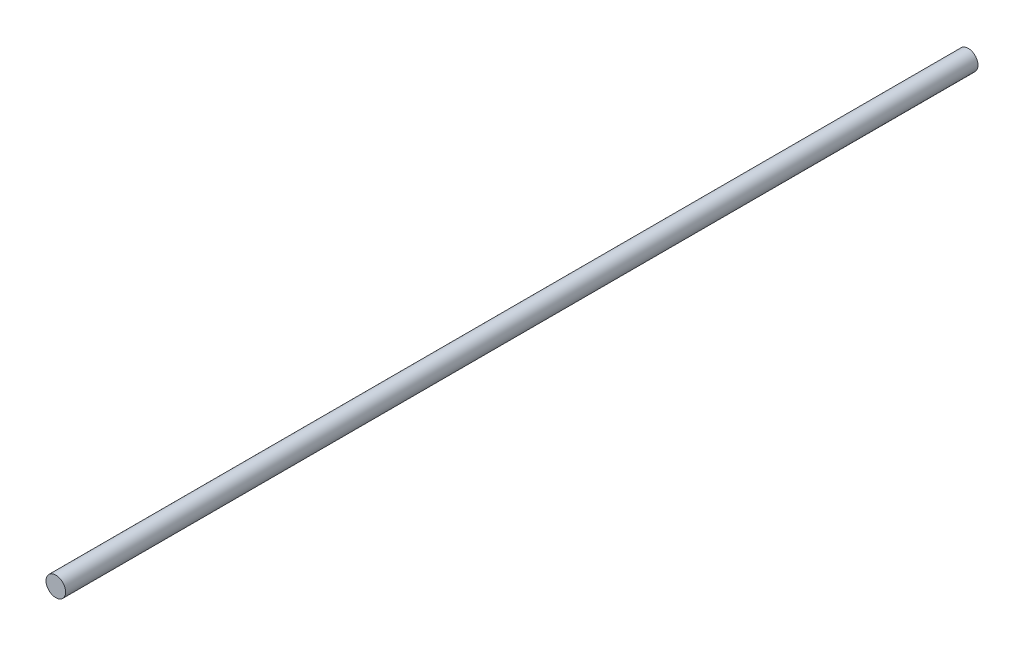
ISO-10303-21;
HEADER;
FILE_DESCRIPTION(('STEP AP214'),'2;1');
FILE_NAME('part.step','',(''),(''),'','','');
FILE_SCHEMA(('AUTOMOTIVE_DESIGN { 1 0 10303 214 1 1 1 1 }'));
ENDSEC;
DATA;
#1=APPLICATION_CONTEXT('core data for automotive mechanical design processes');
#2=APPLICATION_PROTOCOL_DEFINITION('international standard','automotive_design',2000,#1);
#3=PRODUCT_CONTEXT('',#1,'mechanical');
#4=PRODUCT('Part','Part','',(#3));
#5=PRODUCT_RELATED_PRODUCT_CATEGORY('part','',(#4));
#6=PRODUCT_DEFINITION_FORMATION('','',#4);
#7=PRODUCT_DEFINITION_CONTEXT('part definition',#1,'design');
#8=PRODUCT_DEFINITION('design','',#6,#7);
#9=PRODUCT_DEFINITION_SHAPE('','',#8);
#10=(LENGTH_UNIT() NAMED_UNIT(*) SI_UNIT(.MILLI.,.METRE.));
#11=(NAMED_UNIT(*) PLANE_ANGLE_UNIT() SI_UNIT($,.RADIAN.));
#12=(NAMED_UNIT(*) SI_UNIT($,.STERADIAN.) SOLID_ANGLE_UNIT());
#13=UNCERTAINTY_MEASURE_WITH_UNIT(LENGTH_MEASURE(1.E-05),#10,'distance_accuracy_value','');
#14=(GEOMETRIC_REPRESENTATION_CONTEXT(3) GLOBAL_UNCERTAINTY_ASSIGNED_CONTEXT((#13)) GLOBAL_UNIT_ASSIGNED_CONTEXT((#10,
#11,#12)) REPRESENTATION_CONTEXT('',''));
#15=CARTESIAN_POINT('',(0.,0.,0.));
#16=DIRECTION('',(0.,0.,1.));
#17=DIRECTION('',(1.,0.,0.));
#18=AXIS2_PLACEMENT_3D('',#15,#16,#17);
#19=CARTESIAN_POINT('',(0.,0.,372.));
#20=DIRECTION('',(0.,0.,-1.));
#21=DIRECTION('',(-1.,0.,0.));
#22=AXIS2_PLACEMENT_3D('',#19,#20,#21);
#23=CYLINDRICAL_SURFACE('',#22,4.);
#24=CARTESIAN_POINT('',(0.,0.,372.));
#25=DIRECTION('',(0.,0.,1.));
#26=DIRECTION('',(1.,0.,0.));
#27=AXIS2_PLACEMENT_3D('',#24,#25,#26);
#28=CIRCLE('',#27,4.);
#29=CARTESIAN_POINT('',(-4.,0.,372.));
#30=VERTEX_POINT('',#29);
#31=EDGE_CURVE('E10',#30,#30,#28,.T.);
#32=CARTESIAN_POINT('',(0.,0.,0.));
#33=DIRECTION('',(0.,0.,1.));
#34=DIRECTION('',(1.,0.,0.));
#35=AXIS2_PLACEMENT_3D('',#32,#33,#34);
#36=CIRCLE('',#35,4.);
#37=CARTESIAN_POINT('',(-4.,0.,0.));
#38=VERTEX_POINT('',#37);
#39=EDGE_CURVE('E33',#38,#38,#36,.T.);
#40=CARTESIAN_POINT('',(-4.,0.,372.));
#41=CARTESIAN_POINT('',(-4.,0.,368.125));
#42=CARTESIAN_POINT('',(-4.,0.,364.25));
#43=CARTESIAN_POINT('',(-4.,0.,356.5));
#44=CARTESIAN_POINT('',(-4.,0.,352.625));
#45=CARTESIAN_POINT('',(-4.,0.,344.875));
#46=CARTESIAN_POINT('',(-4.,0.,341.));
#47=CARTESIAN_POINT('',(-4.,0.,333.25));
#48=CARTESIAN_POINT('',(-4.,0.,329.375));
#49=CARTESIAN_POINT('',(-4.,0.,321.625));
#50=CARTESIAN_POINT('',(-4.,0.,317.75));
#51=CARTESIAN_POINT('',(-4.,0.,310.));
#52=CARTESIAN_POINT('',(-4.,0.,306.125));
#53=CARTESIAN_POINT('',(-4.,0.,298.375));
#54=CARTESIAN_POINT('',(-4.,0.,294.5));
#55=CARTESIAN_POINT('',(-4.,0.,286.75));
#56=CARTESIAN_POINT('',(-4.,0.,282.875));
#57=CARTESIAN_POINT('',(-4.,0.,275.125));
#58=CARTESIAN_POINT('',(-4.,0.,271.25));
#59=CARTESIAN_POINT('',(-4.,0.,263.5));
#60=CARTESIAN_POINT('',(-4.,0.,259.625));
#61=CARTESIAN_POINT('',(-4.,0.,251.875));
#62=CARTESIAN_POINT('',(-4.,0.,248.));
#63=CARTESIAN_POINT('',(-4.,0.,240.25));
#64=CARTESIAN_POINT('',(-4.,0.,236.375));
#65=CARTESIAN_POINT('',(-4.,0.,228.625));
#66=CARTESIAN_POINT('',(-4.,0.,224.75));
#67=CARTESIAN_POINT('',(-4.,0.,217.));
#68=CARTESIAN_POINT('',(-4.,0.,213.125));
#69=CARTESIAN_POINT('',(-4.,0.,205.375));
#70=CARTESIAN_POINT('',(-4.,0.,201.5));
#71=CARTESIAN_POINT('',(-4.,0.,193.75));
#72=CARTESIAN_POINT('',(-4.,0.,189.875));
#73=CARTESIAN_POINT('',(-4.,0.,182.125));
#74=CARTESIAN_POINT('',(-4.,0.,178.25));
#75=CARTESIAN_POINT('',(-4.,0.,170.5));
#76=CARTESIAN_POINT('',(-4.,0.,166.625));
#77=CARTESIAN_POINT('',(-4.,0.,158.875));
#78=CARTESIAN_POINT('',(-4.,0.,155.));
#79=CARTESIAN_POINT('',(-4.,0.,147.25));
#80=CARTESIAN_POINT('',(-4.,0.,143.375));
#81=CARTESIAN_POINT('',(-4.,0.,135.625));
#82=CARTESIAN_POINT('',(-4.,0.,131.75));
#83=CARTESIAN_POINT('',(-4.,0.,124.));
#84=CARTESIAN_POINT('',(-4.,0.,120.125));
#85=CARTESIAN_POINT('',(-4.,0.,112.375));
#86=CARTESIAN_POINT('',(-4.,0.,108.5));
#87=CARTESIAN_POINT('',(-4.,0.,100.75));
#88=CARTESIAN_POINT('',(-4.,0.,96.875));
#89=CARTESIAN_POINT('',(-4.,0.,89.125));
#90=CARTESIAN_POINT('',(-4.,0.,85.25));
#91=CARTESIAN_POINT('',(-4.,0.,77.5));
#92=CARTESIAN_POINT('',(-4.,0.,73.625));
#93=CARTESIAN_POINT('',(-4.,0.,65.875));
#94=CARTESIAN_POINT('',(-4.,0.,62.));
#95=CARTESIAN_POINT('',(-4.,0.,54.25));
#96=CARTESIAN_POINT('',(-4.,0.,50.375));
#97=CARTESIAN_POINT('',(-4.,0.,42.6249999999999));
#98=CARTESIAN_POINT('',(-4.,0.,38.7499999999999));
#99=CARTESIAN_POINT('',(-4.,0.,30.9999999999999));
#100=CARTESIAN_POINT('',(-4.,0.,27.1249999999999));
#101=CARTESIAN_POINT('',(-4.,0.,19.3749999999999));
#102=CARTESIAN_POINT('',(-4.,0.,15.4999999999999));
#103=CARTESIAN_POINT('',(-4.,0.,7.74999999999994));
#104=CARTESIAN_POINT('',(-4.,0.,3.87499999999994));
#105=CARTESIAN_POINT('',(-4.,0.,0.));
#106=B_SPLINE_CURVE_WITH_KNOTS('',3,(#40,#41,#42,#43,#44,#45,#46,#47,#48,#49,#50,#51,#52,#53,
#54,#55,#56,#57,#58,#59,#60,#61,#62,#63,#64,#65,#66,#67,#68,#69,#70,#71,#72,#73,#74,#75,#76,#77,
#78,#79,#80,#81,#82,#83,#84,#85,#86,#87,#88,#89,#90,#91,#92,#93,#94,#95,#96,#97,#98,#99,#100,
#101,#102,#103,#104,#105),.UNSPECIFIED.,.F.,.F.,(4,2,2,2,2,2,2,2,2,2,2,2,2,2,2,2,2,2,2,2,2,2,2,
2,2,2,2,2,2,2,2,2,4),(0.,11.6250000000001,23.25,34.875,46.5,58.125,69.75,81.375,93.,104.625,
116.25,127.875,139.5,151.125,162.75,174.375,186.,197.625,209.25,220.875,232.5,244.125,255.75,
267.375,279.,290.625,302.25,313.875,325.5,337.125,348.75,360.375,372.),.UNSPECIFIED.);
#107=EDGE_CURVE('BSEAM30',#30,#38,#106,.T.);
#108=ORIENTED_EDGE('',*,*,#31,.F.);
#109=ORIENTED_EDGE('',*,*,#39,.T.);
#110=ORIENTED_EDGE('',*,*,#107,.T.);
#111=ORIENTED_EDGE('',*,*,#107,.F.);
#112=EDGE_LOOP('',(#108,#110,#109,#111));
#113=FACE_BOUND('',#112,.T.);
#114=ADVANCED_FACE('F30',(#113),#23,.T.);
#115=CARTESIAN_POINT('',(0.,0.,372.));
#116=DIRECTION('',(0.,0.,1.));
#117=DIRECTION('',(1.,0.,0.));
#118=AXIS2_PLACEMENT_3D('',#115,#116,#117);
#119=PLANE('',#118);
#120=ORIENTED_EDGE('',*,*,#31,.T.);
#121=EDGE_LOOP('',(#120));
#122=FACE_BOUND('',#121,.T.);
#123=ADVANCED_FACE('F45',(#122),#119,.T.);
#124=CARTESIAN_POINT('',(0.,0.,0.));
#125=DIRECTION('',(0.,0.,1.));
#126=DIRECTION('',(1.,0.,0.));
#127=AXIS2_PLACEMENT_3D('',#124,#125,#126);
#128=PLANE('',#127);
#129=ORIENTED_EDGE('',*,*,#39,.F.);
#130=EDGE_LOOP('',(#129));
#131=FACE_BOUND('',#130,.T.);
#132=ADVANCED_FACE('F43',(#131),#128,.F.);
#133=CLOSED_SHELL('',(#114,#123,#132));
#134=MANIFOLD_SOLID_BREP('B2',#133);
#135=ADVANCED_BREP_SHAPE_REPRESENTATION('',(#18,#134),#14);
#136=SHAPE_DEFINITION_REPRESENTATION(#9,#135);
ENDSEC;
END-ISO-10303-21;
